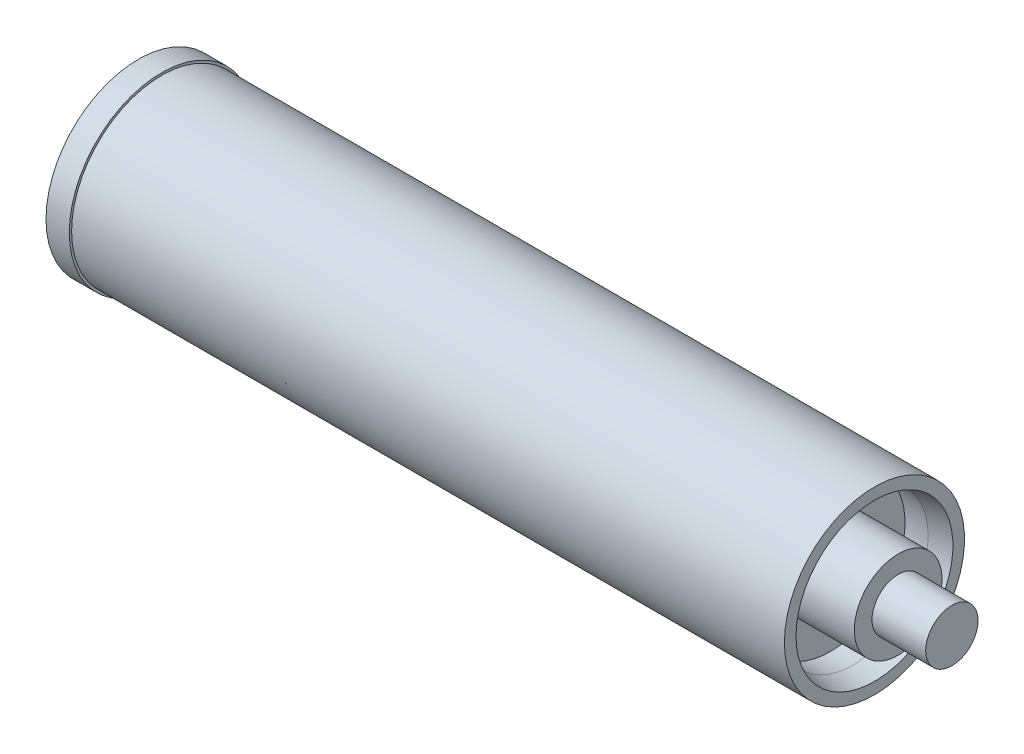
ISO-10303-21;
HEADER;
FILE_DESCRIPTION(('STEP AP214'),'2;1');
FILE_NAME('part.step','',(''),(''),'','','');
FILE_SCHEMA(('AUTOMOTIVE_DESIGN { 1 0 10303 214 1 1 1 1 }'));
ENDSEC;
DATA;
#1=APPLICATION_CONTEXT('core data for automotive mechanical design processes');
#2=APPLICATION_PROTOCOL_DEFINITION('international standard','automotive_design',2000,#1);
#3=PRODUCT_CONTEXT('',#1,'mechanical');
#4=PRODUCT('Part','Part','',(#3));
#5=PRODUCT_RELATED_PRODUCT_CATEGORY('part','',(#4));
#6=PRODUCT_DEFINITION_FORMATION('','',#4);
#7=PRODUCT_DEFINITION_CONTEXT('part definition',#1,'design');
#8=PRODUCT_DEFINITION('design','',#6,#7);
#9=PRODUCT_DEFINITION_SHAPE('','',#8);
#10=(LENGTH_UNIT() NAMED_UNIT(*) SI_UNIT(.MILLI.,.METRE.));
#11=(NAMED_UNIT(*) PLANE_ANGLE_UNIT() SI_UNIT($,.RADIAN.));
#12=(NAMED_UNIT(*) SI_UNIT($,.STERADIAN.) SOLID_ANGLE_UNIT());
#13=UNCERTAINTY_MEASURE_WITH_UNIT(LENGTH_MEASURE(1.E-05),#10,'distance_accuracy_value','');
#14=(GEOMETRIC_REPRESENTATION_CONTEXT(3) GLOBAL_UNCERTAINTY_ASSIGNED_CONTEXT((#13)) GLOBAL_UNIT_ASSIGNED_CONTEXT((#10,
#11,#12)) REPRESENTATION_CONTEXT('',''));
#15=CARTESIAN_POINT('',(0.,0.,0.));
#16=DIRECTION('',(0.,0.,1.));
#17=DIRECTION('',(1.,0.,0.));
#18=AXIS2_PLACEMENT_3D('',#15,#16,#17);
#19=CARTESIAN_POINT('',(36.5674158404261,35.6891384392189,0.));
#20=DIRECTION('',(1.,0.,0.));
#21=DIRECTION('',(0.,0.,-1.));
#22=AXIS2_PLACEMENT_3D('',#19,#20,#21);
#23=PLANE('',#22);
#24=CARTESIAN_POINT('',(36.5674158404261,0.,0.));
#25=DIRECTION('',(-1.,0.,0.));
#26=DIRECTION('',(0.,0.,1.));
#27=AXIS2_PLACEMENT_3D('',#24,#25,#26);
#28=CIRCLE('',#27,26.);
#29=CARTESIAN_POINT('',(36.5674158404261,0.,26.));
#30=VERTEX_POINT('',#29);
#31=EDGE_CURVE('E79',#30,#30,#28,.T.);
#32=ORIENTED_EDGE('',*,*,#31,.F.);
#33=EDGE_LOOP('',(#32));
#34=FACE_BOUND('',#33,.T.);
#35=CARTESIAN_POINT('',(36.5674158404261,0.,0.));
#36=DIRECTION('',(-1.,0.,0.));
#37=DIRECTION('',(0.,0.,1.));
#38=AXIS2_PLACEMENT_3D('',#35,#36,#37);
#39=CIRCLE('',#38,35.6891384392189);
#40=CARTESIAN_POINT('',(36.5674158404261,0.,35.6891384392189));
#41=VERTEX_POINT('',#40);
#42=EDGE_CURVE('E11',#41,#41,#39,.T.);
#43=ORIENTED_EDGE('',*,*,#42,.T.);
#44=EDGE_LOOP('',(#43));
#45=FACE_BOUND('',#44,.T.);
#46=ADVANCED_FACE('F40',(#34,#45),#23,.F.);
#47=CARTESIAN_POINT('',(0.,0.,0.));
#48=DIRECTION('',(-1.,0.,0.));
#49=DIRECTION('',(0.,0.,1.));
#50=AXIS2_PLACEMENT_3D('',#47,#48,#49);
#51=CYLINDRICAL_SURFACE('',#50,35.6891384392189);
#52=ORIENTED_EDGE('',*,*,#42,.F.);
#53=EDGE_LOOP('',(#52));
#54=FACE_BOUND('',#53,.T.);
#55=CARTESIAN_POINT('',(25.4,0.,0.));
#56=DIRECTION('',(-1.,0.,0.));
#57=DIRECTION('',(0.,0.,1.));
#58=AXIS2_PLACEMENT_3D('',#55,#56,#57);
#59=CIRCLE('',#58,35.6891384392189);
#60=CARTESIAN_POINT('',(25.4,0.,35.6891384392189));
#61=VERTEX_POINT('',#60);
#62=EDGE_CURVE('E47',#61,#61,#59,.T.);
#63=ORIENTED_EDGE('',*,*,#62,.T.);
#64=EDGE_LOOP('',(#63));
#65=FACE_BOUND('',#64,.T.);
#66=ADVANCED_FACE('F68',(#54,#65),#51,.F.);
#67=CARTESIAN_POINT('',(12.7,0.,0.));
#68=DIRECTION('',(-1.,0.,0.));
#69=DIRECTION('',(0.,0.,1.));
#70=AXIS2_PLACEMENT_3D('',#67,#68,#69);
#71=CONICAL_SURFACE('',#70,38.2095,0.195908259244877);
#72=ORIENTED_EDGE('',*,*,#62,.F.);
#73=EDGE_LOOP('',(#72));
#74=FACE_BOUND('',#73,.T.);
#75=CARTESIAN_POINT('',(12.7,0.,0.));
#76=DIRECTION('',(-1.,0.,0.));
#77=DIRECTION('',(0.,0.,1.));
#78=AXIS2_PLACEMENT_3D('',#75,#76,#77);
#79=CIRCLE('',#78,38.2095);
#80=CARTESIAN_POINT('',(12.7,0.,38.2095));
#81=VERTEX_POINT('',#80);
#82=EDGE_CURVE('E86',#81,#81,#79,.T.);
#83=ORIENTED_EDGE('',*,*,#82,.T.);
#84=EDGE_LOOP('',(#83));
#85=FACE_BOUND('',#84,.T.);
#86=ADVANCED_FACE('F74',(#74,#85),#71,.F.);
#87=CARTESIAN_POINT('',(12.7,50.419,0.));
#88=DIRECTION('',(1.,0.,0.));
#89=DIRECTION('',(0.,0.,-1.));
#90=AXIS2_PLACEMENT_3D('',#87,#88,#89);
#91=PLANE('',#90);
#92=ORIENTED_EDGE('',*,*,#82,.F.);
#93=EDGE_LOOP('',(#92));
#94=FACE_BOUND('',#93,.T.);
#95=CARTESIAN_POINT('',(12.7,0.,0.));
#96=DIRECTION('',(-1.,0.,0.));
#97=DIRECTION('',(0.,0.,1.));
#98=AXIS2_PLACEMENT_3D('',#95,#96,#97);
#99=CIRCLE('',#98,50.419);
#100=CARTESIAN_POINT('',(12.7,0.,50.419));
#101=VERTEX_POINT('',#100);
#102=EDGE_CURVE('E91',#101,#101,#99,.T.);
#103=ORIENTED_EDGE('',*,*,#102,.T.);
#104=EDGE_LOOP('',(#103));
#105=FACE_BOUND('',#104,.T.);
#106=ADVANCED_FACE('F222',(#94,#105),#91,.F.);
#107=CARTESIAN_POINT('',(0.,0.,0.));
#108=DIRECTION('',(-1.,0.,0.));
#109=DIRECTION('',(0.,0.,1.));
#110=AXIS2_PLACEMENT_3D('',#107,#108,#109);
#111=CYLINDRICAL_SURFACE('',#110,50.419);
#112=CARTESIAN_POINT('',(25.4,0.,0.));
#113=DIRECTION('',(-1.,0.,0.));
#114=DIRECTION('',(0.,0.,1.));
#115=AXIS2_PLACEMENT_3D('',#112,#113,#114);
#116=CIRCLE('',#115,50.419);
#117=CARTESIAN_POINT('',(25.4,0.,50.419));
#118=VERTEX_POINT('',#117);
#119=EDGE_CURVE('E97',#118,#118,#116,.T.);
#120=ORIENTED_EDGE('',*,*,#119,.T.);
#121=EDGE_LOOP('',(#120));
#122=FACE_BOUND('',#121,.T.);
#123=ORIENTED_EDGE('',*,*,#102,.F.);
#124=EDGE_LOOP('',(#123));
#125=FACE_BOUND('',#124,.T.);
#126=ADVANCED_FACE('F218',(#122,#125),#111,.T.);
#127=CARTESIAN_POINT('',(25.4,50.419,0.));
#128=DIRECTION('',(1.,0.,0.));
#129=DIRECTION('',(0.,0.,-1.));
#130=AXIS2_PLACEMENT_3D('',#127,#128,#129);
#131=PLANE('',#130);
#132=CARTESIAN_POINT('',(25.4,0.,0.));
#133=DIRECTION('',(-1.,0.,0.));
#134=DIRECTION('',(0.,0.,1.));
#135=AXIS2_PLACEMENT_3D('',#132,#133,#134);
#136=CIRCLE('',#135,49.149);
#137=CARTESIAN_POINT('',(25.4,0.,49.149));
#138=VERTEX_POINT('',#137);
#139=EDGE_CURVE('E101',#138,#138,#136,.T.);
#140=ORIENTED_EDGE('',*,*,#139,.T.);
#141=EDGE_LOOP('',(#140));
#142=FACE_BOUND('',#141,.T.);
#143=ORIENTED_EDGE('',*,*,#119,.F.);
#144=EDGE_LOOP('',(#143));
#145=FACE_BOUND('',#144,.T.);
#146=ADVANCED_FACE('F214',(#142,#145),#131,.T.);
#147=CARTESIAN_POINT('',(0.,0.,0.));
#148=DIRECTION('',(-1.,0.,0.));
#149=DIRECTION('',(0.,0.,1.));
#150=AXIS2_PLACEMENT_3D('',#147,#148,#149);
#151=CYLINDRICAL_SURFACE('',#150,49.149);
#152=CARTESIAN_POINT('',(414.3502,0.,0.));
#153=DIRECTION('',(-1.,0.,0.));
#154=DIRECTION('',(0.,0.,1.));
#155=AXIS2_PLACEMENT_3D('',#152,#153,#154);
#156=CIRCLE('',#155,49.149);
#157=CARTESIAN_POINT('',(414.3502,0.,49.149));
#158=VERTEX_POINT('',#157);
#159=EDGE_CURVE('E104',#158,#158,#156,.T.);
#160=ORIENTED_EDGE('',*,*,#159,.T.);
#161=EDGE_LOOP('',(#160));
#162=FACE_BOUND('',#161,.T.);
#163=ORIENTED_EDGE('',*,*,#139,.F.);
#164=EDGE_LOOP('',(#163));
#165=FACE_BOUND('',#164,.T.);
#166=ADVANCED_FACE('F210',(#162,#165),#151,.T.);
#167=CARTESIAN_POINT('',(414.3502,49.149,0.));
#168=DIRECTION('',(1.,0.,0.));
#169=DIRECTION('',(0.,0.,-1.));
#170=AXIS2_PLACEMENT_3D('',#167,#168,#169);
#171=PLANE('',#170);
#172=CARTESIAN_POINT('',(414.3502,0.,0.));
#173=DIRECTION('',(-1.,0.,0.));
#174=DIRECTION('',(0.,0.,1.));
#175=AXIS2_PLACEMENT_3D('',#172,#173,#174);
#176=CIRCLE('',#175,42.8201877110918);
#177=CARTESIAN_POINT('',(414.3502,0.,42.8201877110918));
#178=VERTEX_POINT('',#177);
#179=EDGE_CURVE('E108',#178,#178,#176,.T.);
#180=ORIENTED_EDGE('',*,*,#179,.T.);
#181=EDGE_LOOP('',(#180));
#182=FACE_BOUND('',#181,.T.);
#183=ORIENTED_EDGE('',*,*,#159,.F.);
#184=EDGE_LOOP('',(#183));
#185=FACE_BOUND('',#184,.T.);
#186=ADVANCED_FACE('F206',(#182,#185),#171,.T.);
#187=CARTESIAN_POINT('',(414.3502,0.,0.));
#188=DIRECTION('',(1.,0.,0.));
#189=DIRECTION('',(0.,0.,-1.));
#190=AXIS2_PLACEMENT_3D('',#187,#188,#189);
#191=CONICAL_SURFACE('',#190,42.8201877110918,0.195908259244878);
#192=CARTESIAN_POINT('',(403.027348349975,0.,0.));
#193=DIRECTION('',(-1.,0.,0.));
#194=DIRECTION('',(0.,0.,1.));
#195=AXIS2_PLACEMENT_3D('',#192,#193,#194);
#196=CIRCLE('',#195,40.573126289269);
#197=CARTESIAN_POINT('',(403.027348349975,0.,40.573126289269));
#198=VERTEX_POINT('',#197);
#199=EDGE_CURVE('E112',#198,#198,#196,.T.);
#200=ORIENTED_EDGE('',*,*,#199,.T.);
#201=EDGE_LOOP('',(#200));
#202=FACE_BOUND('',#201,.T.);
#203=ORIENTED_EDGE('',*,*,#179,.F.);
#204=EDGE_LOOP('',(#203));
#205=FACE_BOUND('',#204,.T.);
#206=ADVANCED_FACE('F202',(#202,#205),#191,.F.);
#207=CARTESIAN_POINT('',(0.,0.,0.));
#208=DIRECTION('',(-1.,0.,0.));
#209=DIRECTION('',(0.,0.,1.));
#210=AXIS2_PLACEMENT_3D('',#207,#208,#209);
#211=CYLINDRICAL_SURFACE('',#210,40.573126289269);
#212=CARTESIAN_POINT('',(390.454818394821,0.,0.));
#213=DIRECTION('',(-1.,0.,0.));
#214=DIRECTION('',(0.,0.,1.));
#215=AXIS2_PLACEMENT_3D('',#212,#213,#214);
#216=CIRCLE('',#215,40.573126289269);
#217=CARTESIAN_POINT('',(390.454818394821,0.,40.573126289269));
#218=VERTEX_POINT('',#217);
#219=EDGE_CURVE('E116',#218,#218,#216,.T.);
#220=ORIENTED_EDGE('',*,*,#219,.T.);
#221=EDGE_LOOP('',(#220));
#222=FACE_BOUND('',#221,.T.);
#223=ORIENTED_EDGE('',*,*,#199,.F.);
#224=EDGE_LOOP('',(#223));
#225=FACE_BOUND('',#224,.T.);
#226=ADVANCED_FACE('F198',(#222,#225),#211,.F.);
#227=CARTESIAN_POINT('',(390.454818394821,40.573126289269,0.));
#228=DIRECTION('',(1.,0.,0.));
#229=DIRECTION('',(0.,0.,-1.));
#230=AXIS2_PLACEMENT_3D('',#227,#228,#229);
#231=PLANE('',#230);
#232=CARTESIAN_POINT('',(390.454818394821,0.,0.));
#233=DIRECTION('',(-1.,0.,0.));
#234=DIRECTION('',(0.,0.,1.));
#235=AXIS2_PLACEMENT_3D('',#232,#233,#234);
#236=CIRCLE('',#235,23.9395);
#237=CARTESIAN_POINT('',(390.454818394821,0.,23.9395));
#238=VERTEX_POINT('',#237);
#239=EDGE_CURVE('E120',#238,#238,#236,.T.);
#240=ORIENTED_EDGE('',*,*,#239,.T.);
#241=EDGE_LOOP('',(#240));
#242=FACE_BOUND('',#241,.T.);
#243=ORIENTED_EDGE('',*,*,#219,.F.);
#244=EDGE_LOOP('',(#243));
#245=FACE_BOUND('',#244,.T.);
#246=ADVANCED_FACE('F194',(#242,#245),#231,.T.);
#247=CARTESIAN_POINT('',(0.,0.,0.));
#248=DIRECTION('',(-1.,0.,0.));
#249=DIRECTION('',(0.,0.,1.));
#250=AXIS2_PLACEMENT_3D('',#247,#248,#249);
#251=CYLINDRICAL_SURFACE('',#250,23.9395);
#252=CARTESIAN_POINT('',(427.3042,0.,0.));
#253=DIRECTION('',(-1.,0.,0.));
#254=DIRECTION('',(0.,0.,1.));
#255=AXIS2_PLACEMENT_3D('',#252,#253,#254);
#256=CIRCLE('',#255,23.9395);
#257=CARTESIAN_POINT('',(427.3042,0.,23.9395));
#258=VERTEX_POINT('',#257);
#259=EDGE_CURVE('E124',#258,#258,#256,.T.);
#260=ORIENTED_EDGE('',*,*,#259,.T.);
#261=EDGE_LOOP('',(#260));
#262=FACE_BOUND('',#261,.T.);
#263=ORIENTED_EDGE('',*,*,#239,.F.);
#264=EDGE_LOOP('',(#263));
#265=FACE_BOUND('',#264,.T.);
#266=ADVANCED_FACE('F190',(#262,#265),#251,.T.);
#267=CARTESIAN_POINT('',(427.3042,23.9395,0.));
#268=DIRECTION('',(1.,0.,0.));
#269=DIRECTION('',(0.,0.,-1.));
#270=AXIS2_PLACEMENT_3D('',#267,#268,#269);
#271=PLANE('',#270);
#272=CARTESIAN_POINT('',(427.3042,0.,0.));
#273=DIRECTION('',(-1.,0.,0.));
#274=DIRECTION('',(0.,0.,1.));
#275=AXIS2_PLACEMENT_3D('',#272,#273,#274);
#276=CIRCLE('',#275,14.2875);
#277=CARTESIAN_POINT('',(427.3042,0.,14.2875));
#278=VERTEX_POINT('',#277);
#279=EDGE_CURVE('E128',#278,#278,#276,.T.);
#280=ORIENTED_EDGE('',*,*,#279,.T.);
#281=EDGE_LOOP('',(#280));
#282=FACE_BOUND('',#281,.T.);
#283=ORIENTED_EDGE('',*,*,#259,.F.);
#284=EDGE_LOOP('',(#283));
#285=FACE_BOUND('',#284,.T.);
#286=ADVANCED_FACE('F186',(#282,#285),#271,.T.);
#287=CARTESIAN_POINT('',(0.,0.,0.));
#288=DIRECTION('',(-1.,0.,0.));
#289=DIRECTION('',(0.,0.,1.));
#290=AXIS2_PLACEMENT_3D('',#287,#288,#289);
#291=CYLINDRICAL_SURFACE('',#290,14.2875);
#292=CARTESIAN_POINT('',(456.5904,0.,0.));
#293=DIRECTION('',(-1.,0.,0.));
#294=DIRECTION('',(0.,0.,1.));
#295=AXIS2_PLACEMENT_3D('',#292,#293,#294);
#296=CIRCLE('',#295,14.2875);
#297=CARTESIAN_POINT('',(456.5904,0.,14.2875));
#298=VERTEX_POINT('',#297);
#299=EDGE_CURVE('E132',#298,#298,#296,.T.);
#300=ORIENTED_EDGE('',*,*,#299,.T.);
#301=EDGE_LOOP('',(#300));
#302=FACE_BOUND('',#301,.T.);
#303=ORIENTED_EDGE('',*,*,#279,.F.);
#304=EDGE_LOOP('',(#303));
#305=FACE_BOUND('',#304,.T.);
#306=ADVANCED_FACE('F180',(#302,#305),#291,.T.);
#307=CARTESIAN_POINT('',(456.5904,0.,0.));
#308=DIRECTION('',(-1.,0.,0.));
#309=DIRECTION('',(0.,0.,1.));
#310=AXIS2_PLACEMENT_3D('',#307,#308,#309);
#311=PLANE('',#310);
#312=ORIENTED_EDGE('',*,*,#299,.F.);
#313=EDGE_LOOP('',(#312));
#314=FACE_BOUND('',#313,.T.);
#315=ADVANCED_FACE('F173',(#314),#311,.F.);
#316=CARTESIAN_POINT('',(0.,26.,0.));
#317=DIRECTION('',(1.,0.,0.));
#318=DIRECTION('',(0.,0.,-1.));
#319=AXIS2_PLACEMENT_3D('',#316,#317,#318);
#320=PLANE('',#319);
#321=CARTESIAN_POINT('',(0.,0.,0.));
#322=DIRECTION('',(-1.,0.,0.));
#323=DIRECTION('',(0.,0.,1.));
#324=AXIS2_PLACEMENT_3D('',#321,#322,#323);
#325=CIRCLE('',#324,20.);
#326=CARTESIAN_POINT('',(0.,0.,20.));
#327=VERTEX_POINT('',#326);
#328=EDGE_CURVE('E164',#327,#327,#325,.T.);
#329=ORIENTED_EDGE('',*,*,#328,.F.);
#330=EDGE_LOOP('',(#329));
#331=FACE_BOUND('',#330,.T.);
#332=CARTESIAN_POINT('',(0.,0.,0.));
#333=DIRECTION('',(-1.,0.,0.));
#334=DIRECTION('',(0.,0.,1.));
#335=AXIS2_PLACEMENT_3D('',#332,#333,#334);
#336=CIRCLE('',#335,26.);
#337=CARTESIAN_POINT('',(0.,0.,26.));
#338=VERTEX_POINT('',#337);
#339=EDGE_CURVE('E136',#338,#338,#336,.T.);
#340=ORIENTED_EDGE('',*,*,#339,.T.);
#341=EDGE_LOOP('',(#340));
#342=FACE_BOUND('',#341,.T.);
#343=ADVANCED_FACE('F63',(#331,#342),#320,.F.);
#344=CARTESIAN_POINT('',(0.,0.,0.));
#345=DIRECTION('',(-1.,0.,0.));
#346=DIRECTION('',(0.,0.,1.));
#347=AXIS2_PLACEMENT_3D('',#344,#345,#346);
#348=CYLINDRICAL_SURFACE('',#347,26.);
#349=ORIENTED_EDGE('',*,*,#31,.T.);
#350=EDGE_LOOP('',(#349));
#351=FACE_BOUND('',#350,.T.);
#352=ORIENTED_EDGE('',*,*,#339,.F.);
#353=EDGE_LOOP('',(#352));
#354=FACE_BOUND('',#353,.T.);
#355=ADVANCED_FACE('F53',(#351,#354),#348,.T.);
#356=CARTESIAN_POINT('',(390.090795286598,0.,0.));
#357=DIRECTION('',(1.,0.,0.));
#358=DIRECTION('',(0.,0.,-1.));
#359=AXIS2_PLACEMENT_3D('',#356,#357,#358);
#360=CONICAL_SURFACE('',#359,0.,1.54271064942604);
#361=CARTESIAN_POINT('',(390.454818394821,0.,0.));
#362=DIRECTION('',(-1.,0.,0.));
#363=DIRECTION('',(0.,0.,1.));
#364=AXIS2_PLACEMENT_3D('',#361,#362,#363);
#365=CIRCLE('',#364,12.9577572212731);
#366=CARTESIAN_POINT('',(390.454818394821,0.,12.9577572212731));
#367=VERTEX_POINT('',#366);
#368=EDGE_CURVE('E141',#367,#367,#365,.T.);
#369=ORIENTED_EDGE('',*,*,#368,.T.);
#370=EDGE_LOOP('',(#369));
#371=FACE_BOUND('',#370,.T.);
#372=CARTESIAN_POINT('',(390.090795286598,0.,0.));
#373=VERTEX_POINT('',#372);
#374=VERTEX_LOOP('',#373);
#375=FACE_BOUND('',#374,.T.);
#376=ADVANCED_FACE('F50',(#371,#375),#360,.T.);
#377=CARTESIAN_POINT('',(0.,0.,0.));
#378=DIRECTION('',(-1.,0.,0.));
#379=DIRECTION('',(0.,0.,1.));
#380=AXIS2_PLACEMENT_3D('',#377,#378,#379);
#381=CYLINDRICAL_SURFACE('',#380,12.9577572212731);
#382=CARTESIAN_POINT('',(381.061065958821,0.,0.));
#383=DIRECTION('',(-1.,0.,0.));
#384=DIRECTION('',(0.,0.,1.));
#385=AXIS2_PLACEMENT_3D('',#382,#383,#384);
#386=CIRCLE('',#385,12.9577572212731);
#387=CARTESIAN_POINT('',(381.061065958821,0.,12.9577572212731));
#388=VERTEX_POINT('',#387);
#389=EDGE_CURVE('E144',#388,#388,#386,.T.);
#390=ORIENTED_EDGE('',*,*,#389,.T.);
#391=EDGE_LOOP('',(#390));
#392=FACE_BOUND('',#391,.T.);
#393=ORIENTED_EDGE('',*,*,#368,.F.);
#394=EDGE_LOOP('',(#393));
#395=FACE_BOUND('',#394,.T.);
#396=ADVANCED_FACE('F52',(#392,#395),#381,.F.);
#397=CARTESIAN_POINT('',(381.061065958821,12.9577572212731,0.));
#398=DIRECTION('',(-1.,0.,0.));
#399=DIRECTION('',(0.,0.,1.));
#400=AXIS2_PLACEMENT_3D('',#397,#398,#399);
#401=PLANE('',#400);
#402=CARTESIAN_POINT('',(381.061065958821,0.,0.));
#403=DIRECTION('',(-1.,0.,0.));
#404=DIRECTION('',(0.,0.,1.));
#405=AXIS2_PLACEMENT_3D('',#402,#403,#404);
#406=CIRCLE('',#405,44.271024872523);
#407=CARTESIAN_POINT('',(381.061065958821,0.,44.271024872523));
#408=VERTEX_POINT('',#407);
#409=EDGE_CURVE('E148',#408,#408,#406,.T.);
#410=ORIENTED_EDGE('',*,*,#409,.T.);
#411=EDGE_LOOP('',(#410));
#412=FACE_BOUND('',#411,.T.);
#413=ORIENTED_EDGE('',*,*,#389,.F.);
#414=EDGE_LOOP('',(#413));
#415=FACE_BOUND('',#414,.T.);
#416=ADVANCED_FACE('F60',(#412,#415),#401,.T.);
#417=CARTESIAN_POINT('',(0.,0.,0.));
#418=DIRECTION('',(-1.,0.,0.));
#419=DIRECTION('',(0.,0.,1.));
#420=AXIS2_PLACEMENT_3D('',#417,#418,#419);
#421=CYLINDRICAL_SURFACE('',#420,44.271024872523);
#422=CARTESIAN_POINT('',(65.8718789343533,0.,0.));
#423=DIRECTION('',(-1.,0.,0.));
#424=DIRECTION('',(0.,0.,1.));
#425=AXIS2_PLACEMENT_3D('',#422,#423,#424);
#426=CIRCLE('',#425,44.271024872523);
#427=CARTESIAN_POINT('',(65.8718789343533,0.,-44.271024872523));
#428=VERTEX_POINT('',#427);
#429=EDGE_CURVE('E152',#428,#428,#426,.T.);
#430=ORIENTED_EDGE('',*,*,#429,.T.);
#431=EDGE_LOOP('',(#430));
#432=FACE_BOUND('',#431,.T.);
#433=ORIENTED_EDGE('',*,*,#409,.F.);
#434=EDGE_LOOP('',(#433));
#435=FACE_BOUND('',#434,.T.);
#436=ADVANCED_FACE('F245',(#432,#435),#421,.F.);
#437=CARTESIAN_POINT('',(65.8718789343533,0.,0.));
#438=DIRECTION('',(1.,0.,0.));
#439=DIRECTION('',(0.,0.,-1.));
#440=AXIS2_PLACEMENT_3D('',#437,#438,#439);
#441=CONICAL_SURFACE('',#440,44.271024872523,0.755513024128266);
#442=CARTESIAN_POINT('',(34.0830061399178,0.,0.));
#443=DIRECTION('',(-1.,0.,0.));
#444=DIRECTION('',(0.,0.,1.));
#445=AXIS2_PLACEMENT_3D('',#442,#443,#444);
#446=CIRCLE('',#445,14.3275804068006);
#447=CARTESIAN_POINT('',(34.0830061399178,0.,-14.3275804068006));
#448=VERTEX_POINT('',#447);
#449=EDGE_CURVE('E156',#448,#448,#446,.T.);
#450=CARTESIAN_POINT('',(34.0830061399178,0.,-14.3275804068006));
#451=CARTESIAN_POINT('',(34.4141402315265,0.,-14.6394912866519));
#452=CARTESIAN_POINT('',(34.7452743231352,0.,-14.9514021665031));
#453=CARTESIAN_POINT('',(35.4075425063526,0.,-15.5752239262057));
#454=CARTESIAN_POINT('',(35.7386765979613,0.,-15.887134806057));
#455=CARTESIAN_POINT('',(36.4009447811787,0.,-16.5109565657595));
#456=CARTESIAN_POINT('',(36.7320788727874,0.,-16.8228674456108));
#457=CARTESIAN_POINT('',(37.3943470560048,0.,-17.4466892053133));
#458=CARTESIAN_POINT('',(37.7254811476135,0.,-17.7586000851646));
#459=CARTESIAN_POINT('',(38.3877493308309,0.,-18.3824218448672));
#460=CARTESIAN_POINT('',(38.7188834224396,0.,-18.6943327247184));
#461=CARTESIAN_POINT('',(39.381151605657,0.,-19.318154484421));
#462=CARTESIAN_POINT('',(39.7122856972657,0.,-19.6300653642723));
#463=CARTESIAN_POINT('',(40.3745538804831,0.,-20.2538871239748));
#464=CARTESIAN_POINT('',(40.7056879720918,0.,-20.5657980038261));
#465=CARTESIAN_POINT('',(41.3679561553093,0.,-21.1896197635286));
#466=CARTESIAN_POINT('',(41.699090246918,0.,-21.5015306433799));
#467=CARTESIAN_POINT('',(42.3613584301354,0.,-22.1253524030825));
#468=CARTESIAN_POINT('',(42.6924925217441,0.,-22.4372632829337));
#469=CARTESIAN_POINT('',(43.3547607049615,0.,-23.0610850426363));
#470=CARTESIAN_POINT('',(43.6858947965702,0.,-23.3729959224876));
#471=CARTESIAN_POINT('',(44.3481629797876,0.,-23.9968176821901));
#472=CARTESIAN_POINT('',(44.6792970713963,0.,-24.3087285620414));
#473=CARTESIAN_POINT('',(45.3415652546137,0.,-24.9325503217439));
#474=CARTESIAN_POINT('',(45.6726993462224,0.,-25.2444612015952));
#475=CARTESIAN_POINT('',(46.3349675294398,0.,-25.8682829612978));
#476=CARTESIAN_POINT('',(46.6661016210485,0.,-26.180193841149));
#477=CARTESIAN_POINT('',(47.3283698042659,0.,-26.8040156008516));
#478=CARTESIAN_POINT('',(47.6595038958746,0.,-27.1159264807029));
#479=CARTESIAN_POINT('',(48.321772079092,0.,-27.7397482404054));
#480=CARTESIAN_POINT('',(48.6529061707007,0.,-28.0516591202567));
#481=CARTESIAN_POINT('',(49.3151743539181,0.,-28.6754808799592));
#482=CARTESIAN_POINT('',(49.6463084455268,0.,-28.9873917598105));
#483=CARTESIAN_POINT('',(50.3085766287442,0.,-29.6112135195131));
#484=CARTESIAN_POINT('',(50.6397107203529,0.,-29.9231243993643));
#485=CARTESIAN_POINT('',(51.3019789035703,0.,-30.5469461590669));
#486=CARTESIAN_POINT('',(51.633112995179,0.,-30.8588570389182));
#487=CARTESIAN_POINT('',(52.2953811783965,0.,-31.4826787986207));
#488=CARTESIAN_POINT('',(52.6265152700052,0.,-31.794589678472));
#489=CARTESIAN_POINT('',(53.2887834532226,0.,-32.4184114381745));
#490=CARTESIAN_POINT('',(53.6199175448313,0.,-32.7303223180258));
#491=CARTESIAN_POINT('',(54.2821857280487,0.,-33.3541440777284));
#492=CARTESIAN_POINT('',(54.6133198196574,0.,-33.6660549575796));
#493=CARTESIAN_POINT('',(55.2755880028748,0.,-34.2898767172822));
#494=CARTESIAN_POINT('',(55.6067220944835,0.,-34.6017875971335));
#495=CARTESIAN_POINT('',(56.2689902777009,0.,-35.225609356836));
#496=CARTESIAN_POINT('',(56.6001243693096,0.,-35.5375202366873));
#497=CARTESIAN_POINT('',(57.262392552527,0.,-36.1613419963898));
#498=CARTESIAN_POINT('',(57.5935266441357,0.,-36.4732528762411));
#499=CARTESIAN_POINT('',(58.2557948273531,0.,-37.0970746359437));
#500=CARTESIAN_POINT('',(58.5869289189618,0.,-37.4089855157949));
#501=CARTESIAN_POINT('',(59.2491971021792,0.,-38.0328072754975));
#502=CARTESIAN_POINT('',(59.5803311937879,0.,-38.3447181553488));
#503=CARTESIAN_POINT('',(60.2425993770053,0.,-38.9685399150513));
#504=CARTESIAN_POINT('',(60.573733468614,0.,-39.2804507949026));
#505=CARTESIAN_POINT('',(61.2360016518314,0.,-39.9042725546051));
#506=CARTESIAN_POINT('',(61.5671357434401,0.,-40.2161834344564));
#507=CARTESIAN_POINT('',(62.2294039266575,0.,-40.840005194159));
#508=CARTESIAN_POINT('',(62.5605380182663,0.,-41.1519160740102));
#509=CARTESIAN_POINT('',(63.2228062014837,0.,-41.7757378337128));
#510=CARTESIAN_POINT('',(63.5539402930924,0.,-42.0876487135641));
#511=CARTESIAN_POINT('',(64.2162084763098,0.,-42.7114704732666));
#512=CARTESIAN_POINT('',(64.5473425679185,0.,-43.0233813531179));
#513=CARTESIAN_POINT('',(65.2096107511359,0.,-43.6472031128204));
#514=CARTESIAN_POINT('',(65.5407448427446,0.,-43.9591139926717));
#515=CARTESIAN_POINT('',(65.8718789343533,0.,-44.271024872523));
#516=B_SPLINE_CURVE_WITH_KNOTS('',3,(#450,#451,#452,#453,#454,#455,#456,#457,#458,#459,#460,
#461,#462,#463,#464,#465,#466,#467,#468,#469,#470,#471,#472,#473,#474,#475,#476,#477,#478,#479,
#480,#481,#482,#483,#484,#485,#486,#487,#488,#489,#490,#491,#492,#493,#494,#495,#496,#497,#498,
#499,#500,#501,#502,#503,#504,#505,#506,#507,#508,#509,#510,#511,#512,#513,#514,#515),
.UNSPECIFIED.,.F.,.F.,(4,2,2,2,2,2,2,2,2,2,2,2,2,2,2,2,2,2,2,2,2,2,2,2,2,2,2,2,2,2,2,2,4),(0.,
1.36471376206004,2.72942752412007,4.09414128618011,5.45885504824014,6.82356881030018,
8.18828257236022,9.55299633442025,10.9177100964803,12.2824238585403,13.6471376206004,
15.0118513826604,16.3765651447204,17.7412789067805,19.1059926688405,20.4707064309005,
21.8354201929606,23.2001339550206,24.5648477170806,25.9295614791407,27.2942752412007,
28.6589890032608,30.0237027653208,31.3884165273808,32.7531302894409,34.1178440515009,
35.4825578135609,36.847271575621,38.211985337681,39.576699099741,40.9414128618011,
42.3061266238611,43.6708403859212),.UNSPECIFIED.);
#517=EDGE_CURVE('BSEAM324',#448,#428,#516,.T.);
#518=ORIENTED_EDGE('',*,*,#449,.T.);
#519=ORIENTED_EDGE('',*,*,#429,.F.);
#520=ORIENTED_EDGE('',*,*,#517,.T.);
#521=ORIENTED_EDGE('',*,*,#517,.F.);
#522=EDGE_LOOP('',(#518,#520,#519,#521));
#523=FACE_BOUND('',#522,.T.);
#524=ADVANCED_FACE('F324',(#523),#441,.F.);
#525=CARTESIAN_POINT('',(0.,0.,0.));
#526=DIRECTION('',(-1.,0.,0.));
#527=DIRECTION('',(0.,0.,1.));
#528=AXIS2_PLACEMENT_3D('',#525,#526,#527);
#529=CYLINDRICAL_SURFACE('',#528,14.3275804068006);
#530=CARTESIAN_POINT('',(19.0830061399178,0.,0.));
#531=DIRECTION('',(-1.,0.,0.));
#532=DIRECTION('',(0.,0.,1.));
#533=AXIS2_PLACEMENT_3D('',#530,#531,#532);
#534=CIRCLE('',#533,14.3275804068006);
#535=CARTESIAN_POINT('',(19.0830061399178,0.,14.3275804068006));
#536=VERTEX_POINT('',#535);
#537=EDGE_CURVE('E160',#536,#536,#534,.T.);
#538=ORIENTED_EDGE('',*,*,#537,.T.);
#539=EDGE_LOOP('',(#538));
#540=FACE_BOUND('',#539,.T.);
#541=ORIENTED_EDGE('',*,*,#449,.F.);
#542=EDGE_LOOP('',(#541));
#543=FACE_BOUND('',#542,.T.);
#544=ADVANCED_FACE('F262',(#540,#543),#529,.F.);
#545=CARTESIAN_POINT('',(19.0830061399178,0.,0.));
#546=DIRECTION('',(-1.,0.,0.));
#547=DIRECTION('',(0.,0.,1.));
#548=AXIS2_PLACEMENT_3D('',#545,#546,#547);
#549=CONICAL_SURFACE('',#548,14.3275804068006,0.288931761333724);
#550=ORIENTED_EDGE('',*,*,#328,.T.);
#551=EDGE_LOOP('',(#550));
#552=FACE_BOUND('',#551,.T.);
#553=ORIENTED_EDGE('',*,*,#537,.F.);
#554=EDGE_LOOP('',(#553));
#555=FACE_BOUND('',#554,.T.);
#556=ADVANCED_FACE('F169',(#552,#555),#549,.F.);
#557=CLOSED_SHELL('',(#46,#66,#86,#106,#126,#146,#166,#186,#206,#226,#246,#266,#286,#306,#315,
#343,#355,#376,#396,#416,#436,#524,#544,#556));
#558=MANIFOLD_SOLID_BREP('B2',#557);
#559=ADVANCED_BREP_SHAPE_REPRESENTATION('',(#18,#558),#14);
#560=SHAPE_DEFINITION_REPRESENTATION(#9,#559);
ENDSEC;
END-ISO-10303-21;
